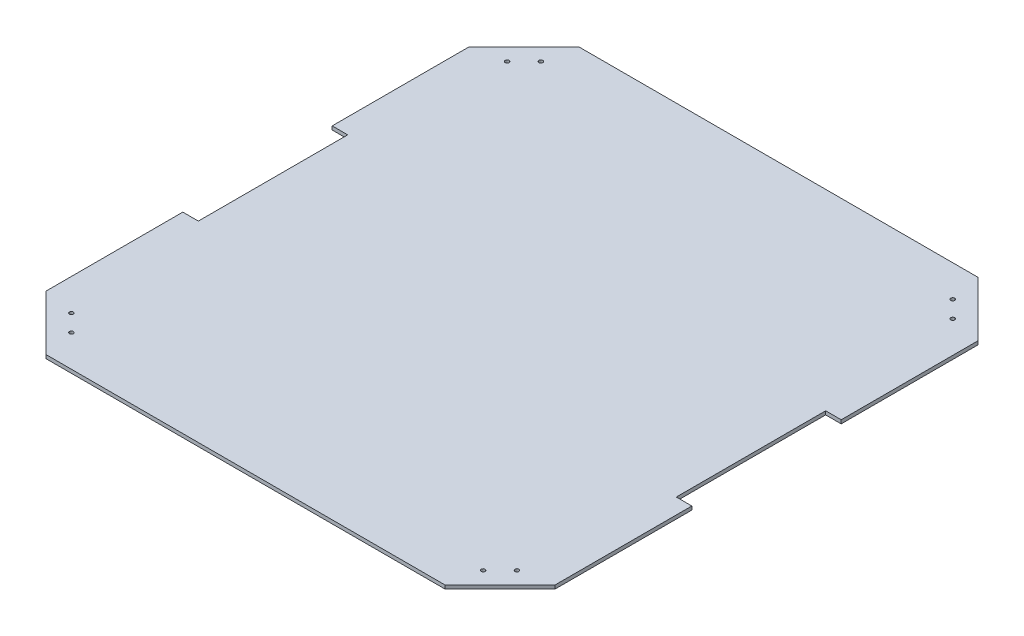
ISO-10303-21;
HEADER;
FILE_DESCRIPTION(('STEP AP214'),'2;1');
FILE_NAME('part.step','',(''),(''),'','','');
FILE_SCHEMA(('AUTOMOTIVE_DESIGN { 1 0 10303 214 1 1 1 1 }'));
ENDSEC;
DATA;
#1=APPLICATION_CONTEXT('core data for automotive mechanical design processes');
#2=APPLICATION_PROTOCOL_DEFINITION('international standard','automotive_design',2000,#1);
#3=PRODUCT_CONTEXT('',#1,'mechanical');
#4=PRODUCT('Part','Part','',(#3));
#5=PRODUCT_RELATED_PRODUCT_CATEGORY('part','',(#4));
#6=PRODUCT_DEFINITION_FORMATION('','',#4);
#7=PRODUCT_DEFINITION_CONTEXT('part definition',#1,'design');
#8=PRODUCT_DEFINITION('design','',#6,#7);
#9=PRODUCT_DEFINITION_SHAPE('','',#8);
#10=(LENGTH_UNIT() NAMED_UNIT(*) SI_UNIT(.MILLI.,.METRE.));
#11=(NAMED_UNIT(*) PLANE_ANGLE_UNIT() SI_UNIT($,.RADIAN.));
#12=(NAMED_UNIT(*) SI_UNIT($,.STERADIAN.) SOLID_ANGLE_UNIT());
#13=UNCERTAINTY_MEASURE_WITH_UNIT(LENGTH_MEASURE(1.E-05),#10,'distance_accuracy_value','');
#14=(GEOMETRIC_REPRESENTATION_CONTEXT(3) GLOBAL_UNCERTAINTY_ASSIGNED_CONTEXT((#13)) GLOBAL_UNIT_ASSIGNED_CONTEXT((#10,
#11,#12)) REPRESENTATION_CONTEXT('',''));
#15=CARTESIAN_POINT('',(0.,0.,0.));
#16=DIRECTION('',(0.,0.,1.));
#17=DIRECTION('',(1.,0.,0.));
#18=AXIS2_PLACEMENT_3D('',#15,#16,#17);
#19=CARTESIAN_POINT('',(-213.,3.,223.));
#20=DIRECTION('',(1.,0.,0.));
#21=DIRECTION('',(0.,0.,-1.));
#22=AXIS2_PLACEMENT_3D('',#19,#20,#21);
#23=PLANE('',#22);
#24=DIRECTION('',(0.,-1.,0.));
#25=VECTOR('',#24,1.);
#26=CARTESIAN_POINT('',(-213.,3.,62.5));
#27=LINE('',#26,#25);
#28=CARTESIAN_POINT('',(-213.,3.,62.5));
#29=VERTEX_POINT('',#28);
#30=CARTESIAN_POINT('',(-213.,0.,62.5));
#31=VERTEX_POINT('',#30);
#32=EDGE_CURVE('E132',#29,#31,#27,.T.);
#33=ORIENTED_EDGE('',*,*,#32,.T.);
#34=DIRECTION('',(0.,0.,1.));
#35=VECTOR('',#34,1.);
#36=CARTESIAN_POINT('',(-213.,0.,223.));
#37=LINE('',#36,#35);
#38=CARTESIAN_POINT('',(-213.,0.,177.));
#39=VERTEX_POINT('',#38);
#40=EDGE_CURVE('E142',#31,#39,#37,.T.);
#41=ORIENTED_EDGE('',*,*,#40,.T.);
#42=DIRECTION('',(0.,1.,0.));
#43=VECTOR('',#42,1.);
#44=CARTESIAN_POINT('',(-213.,3.,177.));
#45=LINE('',#44,#43);
#46=CARTESIAN_POINT('',(-213.,3.,177.));
#47=VERTEX_POINT('',#46);
#48=EDGE_CURVE('E155',#39,#47,#45,.T.);
#49=ORIENTED_EDGE('',*,*,#48,.T.);
#50=DIRECTION('',(0.,0.,1.));
#51=VECTOR('',#50,1.);
#52=CARTESIAN_POINT('',(-213.,3.,223.));
#53=LINE('',#52,#51);
#54=EDGE_CURVE('E148',#29,#47,#53,.T.);
#55=ORIENTED_EDGE('',*,*,#54,.F.);
#56=EDGE_LOOP('',(#33,#41,#49,#55));
#57=FACE_BOUND('',#56,.T.);
#58=ADVANCED_FACE('F17',(#57),#23,.F.);
#59=DIRECTION('',(0.,-1.,0.));
#60=VECTOR('',#59,1.);
#61=CARTESIAN_POINT('',(-213.,3.,-62.5));
#62=LINE('',#61,#60);
#63=CARTESIAN_POINT('',(-213.,3.,-62.5));
#64=VERTEX_POINT('',#63);
#65=CARTESIAN_POINT('',(-213.,0.,-62.5));
#66=VERTEX_POINT('',#65);
#67=EDGE_CURVE('E41',#64,#66,#62,.T.);
#68=ORIENTED_EDGE('',*,*,#67,.F.);
#69=CARTESIAN_POINT('',(-213.,3.,-177.));
#70=VERTEX_POINT('',#69);
#71=EDGE_CURVE('E157',#70,#64,#53,.T.);
#72=ORIENTED_EDGE('',*,*,#71,.F.);
#73=DIRECTION('',(0.,-1.,0.));
#74=VECTOR('',#73,1.);
#75=CARTESIAN_POINT('',(-213.,3.,-177.));
#76=LINE('',#75,#74);
#77=CARTESIAN_POINT('',(-213.,0.,-177.));
#78=VERTEX_POINT('',#77);
#79=EDGE_CURVE('E188',#70,#78,#76,.T.);
#80=ORIENTED_EDGE('',*,*,#79,.T.);
#81=EDGE_CURVE('E178',#78,#66,#37,.T.);
#82=ORIENTED_EDGE('',*,*,#81,.T.);
#83=EDGE_LOOP('',(#68,#72,#80,#82));
#84=FACE_BOUND('',#83,.T.);
#85=ADVANCED_FACE('F294',(#84),#23,.F.);
#86=CARTESIAN_POINT('',(213.,3.,223.));
#87=DIRECTION('',(-1.,0.,0.));
#88=DIRECTION('',(0.,0.,1.));
#89=AXIS2_PLACEMENT_3D('',#86,#87,#88);
#90=PLANE('',#89);
#91=DIRECTION('',(0.,-1.,0.));
#92=VECTOR('',#91,1.);
#93=CARTESIAN_POINT('',(213.,3.,-62.5));
#94=LINE('',#93,#92);
#95=CARTESIAN_POINT('',(213.,3.,-62.5));
#96=VERTEX_POINT('',#95);
#97=CARTESIAN_POINT('',(213.,0.,-62.5));
#98=VERTEX_POINT('',#97);
#99=EDGE_CURVE('E247',#96,#98,#94,.T.);
#100=ORIENTED_EDGE('',*,*,#99,.T.);
#101=DIRECTION('',(0.,0.,-1.));
#102=VECTOR('',#101,1.);
#103=CARTESIAN_POINT('',(213.,0.,223.));
#104=LINE('',#103,#102);
#105=CARTESIAN_POINT('',(213.,0.,-177.));
#106=VERTEX_POINT('',#105);
#107=EDGE_CURVE('E184',#98,#106,#104,.T.);
#108=ORIENTED_EDGE('',*,*,#107,.T.);
#109=DIRECTION('',(0.,1.,0.));
#110=VECTOR('',#109,1.);
#111=CARTESIAN_POINT('',(213.,3.,-177.));
#112=LINE('',#111,#110);
#113=CARTESIAN_POINT('',(213.,3.,-177.));
#114=VERTEX_POINT('',#113);
#115=EDGE_CURVE('E217',#106,#114,#112,.T.);
#116=ORIENTED_EDGE('',*,*,#115,.T.);
#117=DIRECTION('',(0.,0.,-1.));
#118=VECTOR('',#117,1.);
#119=CARTESIAN_POINT('',(213.,3.,223.));
#120=LINE('',#119,#118);
#121=EDGE_CURVE('E171',#96,#114,#120,.T.);
#122=ORIENTED_EDGE('',*,*,#121,.F.);
#123=EDGE_LOOP('',(#100,#108,#116,#122));
#124=FACE_BOUND('',#123,.T.);
#125=ADVANCED_FACE('F323',(#124),#90,.F.);
#126=DIRECTION('',(0.,-1.,0.));
#127=VECTOR('',#126,1.);
#128=CARTESIAN_POINT('',(213.,3.,62.5));
#129=LINE('',#128,#127);
#130=CARTESIAN_POINT('',(213.,3.,62.5));
#131=VERTEX_POINT('',#130);
#132=CARTESIAN_POINT('',(213.,0.,62.5));
#133=VERTEX_POINT('',#132);
#134=EDGE_CURVE('E33',#131,#133,#129,.T.);
#135=ORIENTED_EDGE('',*,*,#134,.F.);
#136=CARTESIAN_POINT('',(213.,3.,177.));
#137=VERTEX_POINT('',#136);
#138=EDGE_CURVE('E172',#137,#131,#120,.T.);
#139=ORIENTED_EDGE('',*,*,#138,.F.);
#140=DIRECTION('',(0.,-1.,0.));
#141=VECTOR('',#140,1.);
#142=CARTESIAN_POINT('',(213.,3.,177.));
#143=LINE('',#142,#141);
#144=CARTESIAN_POINT('',(213.,0.,177.));
#145=VERTEX_POINT('',#144);
#146=EDGE_CURVE('E214',#137,#145,#143,.T.);
#147=ORIENTED_EDGE('',*,*,#146,.T.);
#148=EDGE_CURVE('E163',#145,#133,#104,.T.);
#149=ORIENTED_EDGE('',*,*,#148,.T.);
#150=EDGE_LOOP('',(#135,#139,#147,#149));
#151=FACE_BOUND('',#150,.T.);
#152=ADVANCED_FACE('F231',(#151),#90,.F.);
#153=CARTESIAN_POINT('',(0.,3.,0.));
#154=DIRECTION('',(0.,1.,0.));
#155=DIRECTION('',(0.,0.,1.));
#156=AXIS2_PLACEMENT_3D('',#153,#154,#155);
#157=PLANE('',#156);
#158=CARTESIAN_POINT('',(186.464466094067,3.,182.322330470337));
#159=DIRECTION('',(0.,1.,0.));
#160=DIRECTION('',(0.,0.,-1.));
#161=AXIS2_PLACEMENT_3D('',#158,#159,#160);
#162=CIRCLE('',#161,1.65);
#163=CARTESIAN_POINT('',(186.464466094067,3.,180.672330470336));
#164=VERTEX_POINT('',#163);
#165=EDGE_CURVE('E565',#164,#164,#162,.T.);
#166=ORIENTED_EDGE('',*,*,#165,.F.);
#167=EDGE_LOOP('',(#166));
#168=FACE_BOUND('',#167,.T.);
#169=CARTESIAN_POINT('',(172.322330470336,3.,196.464466094067));
#170=DIRECTION('',(0.,1.,0.));
#171=DIRECTION('',(0.,0.,-1.));
#172=AXIS2_PLACEMENT_3D('',#169,#170,#171);
#173=CIRCLE('',#172,1.65);
#174=CARTESIAN_POINT('',(172.322330470336,3.,194.814466094067));
#175=VERTEX_POINT('',#174);
#176=EDGE_CURVE('E569',#175,#175,#173,.T.);
#177=ORIENTED_EDGE('',*,*,#176,.F.);
#178=EDGE_LOOP('',(#177));
#179=FACE_BOUND('',#178,.T.);
#180=CARTESIAN_POINT('',(186.464466094067,3.,-182.322330470337));
#181=DIRECTION('',(0.,-1.,0.));
#182=DIRECTION('',(0.,0.,1.));
#183=AXIS2_PLACEMENT_3D('',#180,#181,#182);
#184=CIRCLE('',#183,1.65);
#185=CARTESIAN_POINT('',(186.464466094067,3.,-180.672330470336));
#186=VERTEX_POINT('',#185);
#187=EDGE_CURVE('E579',#186,#186,#184,.T.);
#188=ORIENTED_EDGE('',*,*,#187,.T.);
#189=EDGE_LOOP('',(#188));
#190=FACE_BOUND('',#189,.T.);
#191=CARTESIAN_POINT('',(172.322330470336,3.,-196.464466094067));
#192=DIRECTION('',(0.,-1.,0.));
#193=DIRECTION('',(0.,0.,1.));
#194=AXIS2_PLACEMENT_3D('',#191,#192,#193);
#195=CIRCLE('',#194,1.65);
#196=CARTESIAN_POINT('',(172.322330470336,3.,-194.814466094067));
#197=VERTEX_POINT('',#196);
#198=EDGE_CURVE('E585',#197,#197,#195,.T.);
#199=ORIENTED_EDGE('',*,*,#198,.T.);
#200=EDGE_LOOP('',(#199));
#201=FACE_BOUND('',#200,.T.);
#202=CARTESIAN_POINT('',(-186.464466094067,3.,182.322330470337));
#203=DIRECTION('',(0.,-1.,0.));
#204=DIRECTION('',(0.,0.,-1.));
#205=AXIS2_PLACEMENT_3D('',#202,#203,#204);
#206=CIRCLE('',#205,1.65);
#207=CARTESIAN_POINT('',(-186.464466094067,3.,180.672330470336));
#208=VERTEX_POINT('',#207);
#209=EDGE_CURVE('E288',#208,#208,#206,.T.);
#210=ORIENTED_EDGE('',*,*,#209,.T.);
#211=EDGE_LOOP('',(#210));
#212=FACE_BOUND('',#211,.T.);
#213=CARTESIAN_POINT('',(-172.322330470336,3.,196.464466094067));
#214=DIRECTION('',(0.,-1.,0.));
#215=DIRECTION('',(0.,0.,-1.));
#216=AXIS2_PLACEMENT_3D('',#213,#214,#215);
#217=CIRCLE('',#216,1.65);
#218=CARTESIAN_POINT('',(-172.322330470336,3.,194.814466094067));
#219=VERTEX_POINT('',#218);
#220=EDGE_CURVE('E594',#219,#219,#217,.T.);
#221=ORIENTED_EDGE('',*,*,#220,.T.);
#222=EDGE_LOOP('',(#221));
#223=FACE_BOUND('',#222,.T.);
#224=CARTESIAN_POINT('',(-186.464466094067,3.,-182.322330470337));
#225=DIRECTION('',(0.,1.,0.));
#226=DIRECTION('',(0.,0.,1.));
#227=AXIS2_PLACEMENT_3D('',#224,#225,#226);
#228=CIRCLE('',#227,1.65);
#229=CARTESIAN_POINT('',(-186.464466094067,3.,-180.672330470336));
#230=VERTEX_POINT('',#229);
#231=EDGE_CURVE('E270',#230,#230,#228,.T.);
#232=ORIENTED_EDGE('',*,*,#231,.F.);
#233=EDGE_LOOP('',(#232));
#234=FACE_BOUND('',#233,.T.);
#235=CARTESIAN_POINT('',(-172.322330470336,3.,-196.464466094067));
#236=DIRECTION('',(0.,1.,0.));
#237=DIRECTION('',(0.,0.,1.));
#238=AXIS2_PLACEMENT_3D('',#235,#236,#237);
#239=CIRCLE('',#238,1.65);
#240=CARTESIAN_POINT('',(-172.322330470336,3.,-194.814466094067));
#241=VERTEX_POINT('',#240);
#242=EDGE_CURVE('E278',#241,#241,#239,.T.);
#243=ORIENTED_EDGE('',*,*,#242,.F.);
#244=EDGE_LOOP('',(#243));
#245=FACE_BOUND('',#244,.T.);
#246=DIRECTION('',(0.,0.,-1.));
#247=VECTOR('',#246,1.);
#248=CARTESIAN_POINT('',(-200.,3.,-62.5));
#249=LINE('',#248,#247);
#250=CARTESIAN_POINT('',(-200.,3.,62.5));
#251=VERTEX_POINT('',#250);
#252=CARTESIAN_POINT('',(-200.,3.,-62.5));
#253=VERTEX_POINT('',#252);
#254=EDGE_CURVE('E151',#251,#253,#249,.T.);
#255=ORIENTED_EDGE('',*,*,#254,.F.);
#256=DIRECTION('',(1.,0.,0.));
#257=VECTOR('',#256,1.);
#258=CARTESIAN_POINT('',(-213.,3.,62.5));
#259=LINE('',#258,#257);
#260=EDGE_CURVE('E135',#29,#251,#259,.T.);
#261=ORIENTED_EDGE('',*,*,#260,.F.);
#262=ORIENTED_EDGE('',*,*,#54,.T.);
#263=DIRECTION('',(-0.707106781186546,0.,-0.707106781186549));
#264=VECTOR('',#263,1.);
#265=CARTESIAN_POINT('',(-195.,3.,195.));
#266=LINE('',#265,#264);
#267=CARTESIAN_POINT('',(-167.,3.,223.));
#268=VERTEX_POINT('',#267);
#269=EDGE_CURVE('E208',#47,#268,#266,.F.);
#270=ORIENTED_EDGE('',*,*,#269,.T.);
#271=DIRECTION('',(1.,0.,0.));
#272=VECTOR('',#271,1.);
#273=CARTESIAN_POINT('',(213.,3.,223.));
#274=LINE('',#273,#272);
#275=CARTESIAN_POINT('',(167.,3.,223.));
#276=VERTEX_POINT('',#275);
#277=EDGE_CURVE('E161',#268,#276,#274,.T.);
#278=ORIENTED_EDGE('',*,*,#277,.T.);
#279=DIRECTION('',(-0.707106781186549,0.,0.707106781186546));
#280=VECTOR('',#279,1.);
#281=CARTESIAN_POINT('',(195.,3.,195.));
#282=LINE('',#281,#280);
#283=EDGE_CURVE('E206',#276,#137,#282,.F.);
#284=ORIENTED_EDGE('',*,*,#283,.T.);
#285=ORIENTED_EDGE('',*,*,#138,.T.);
#286=DIRECTION('',(1.,0.,0.));
#287=VECTOR('',#286,1.);
#288=CARTESIAN_POINT('',(213.,3.,62.5));
#289=LINE('',#288,#287);
#290=CARTESIAN_POINT('',(200.,3.,62.5));
#291=VERTEX_POINT('',#290);
#292=EDGE_CURVE('E250',#291,#131,#289,.T.);
#293=ORIENTED_EDGE('',*,*,#292,.F.);
#294=DIRECTION('',(0.,0.,1.));
#295=VECTOR('',#294,1.);
#296=CARTESIAN_POINT('',(200.,3.,-62.5));
#297=LINE('',#296,#295);
#298=CARTESIAN_POINT('',(200.,3.,-62.5));
#299=VERTEX_POINT('',#298);
#300=EDGE_CURVE('E241',#299,#291,#297,.T.);
#301=ORIENTED_EDGE('',*,*,#300,.F.);
#302=DIRECTION('',(-1.,0.,0.));
#303=VECTOR('',#302,1.);
#304=CARTESIAN_POINT('',(213.,3.,-62.5));
#305=LINE('',#304,#303);
#306=EDGE_CURVE('E239',#96,#299,#305,.T.);
#307=ORIENTED_EDGE('',*,*,#306,.F.);
#308=ORIENTED_EDGE('',*,*,#121,.T.);
#309=DIRECTION('',(0.707106781186546,0.,0.707106781186549));
#310=VECTOR('',#309,1.);
#311=CARTESIAN_POINT('',(195.,3.,-195.));
#312=LINE('',#311,#310);
#313=CARTESIAN_POINT('',(167.,3.,-223.));
#314=VERTEX_POINT('',#313);
#315=EDGE_CURVE('E210',#114,#314,#312,.F.);
#316=ORIENTED_EDGE('',*,*,#315,.T.);
#317=DIRECTION('',(-1.,0.,0.));
#318=VECTOR('',#317,1.);
#319=CARTESIAN_POINT('',(213.,3.,-223.));
#320=LINE('',#319,#318);
#321=CARTESIAN_POINT('',(-167.,3.,-223.));
#322=VERTEX_POINT('',#321);
#323=EDGE_CURVE('E175',#314,#322,#320,.T.);
#324=ORIENTED_EDGE('',*,*,#323,.T.);
#325=DIRECTION('',(0.707106781186549,0.,-0.707106781186546));
#326=VECTOR('',#325,1.);
#327=CARTESIAN_POINT('',(-195.,3.,-195.));
#328=LINE('',#327,#326);
#329=EDGE_CURVE('E212',#322,#70,#328,.F.);
#330=ORIENTED_EDGE('',*,*,#329,.T.);
#331=ORIENTED_EDGE('',*,*,#71,.T.);
#332=DIRECTION('',(-1.,0.,0.));
#333=VECTOR('',#332,1.);
#334=CARTESIAN_POINT('',(-213.,3.,-62.5));
#335=LINE('',#334,#333);
#336=EDGE_CURVE('E261',#253,#64,#335,.T.);
#337=ORIENTED_EDGE('',*,*,#336,.F.);
#338=EDGE_LOOP('',(#255,#261,#262,#270,#278,#284,#285,#293,#301,#307,#308,#316,#324,#330,#331,#337));
#339=FACE_BOUND('',#338,.T.);
#340=ADVANCED_FACE('F147',(#168,#179,#190,#201,#212,#223,#234,#245,#339),#157,.T.);
#341=CARTESIAN_POINT('',(0.,0.,0.));
#342=DIRECTION('',(0.,1.,0.));
#343=DIRECTION('',(0.,0.,1.));
#344=AXIS2_PLACEMENT_3D('',#341,#342,#343);
#345=PLANE('',#344);
#346=CARTESIAN_POINT('',(186.464466094067,0.,182.322330470337));
#347=DIRECTION('',(0.,1.,0.));
#348=DIRECTION('',(0.,0.,-1.));
#349=AXIS2_PLACEMENT_3D('',#346,#347,#348);
#350=CIRCLE('',#349,1.65);
#351=CARTESIAN_POINT('',(186.464466094067,0.,180.672330470336));
#352=VERTEX_POINT('',#351);
#353=EDGE_CURVE('E568',#352,#352,#350,.T.);
#354=ORIENTED_EDGE('',*,*,#353,.T.);
#355=EDGE_LOOP('',(#354));
#356=FACE_BOUND('',#355,.T.);
#357=CARTESIAN_POINT('',(172.322330470336,0.,196.464466094067));
#358=DIRECTION('',(0.,1.,0.));
#359=DIRECTION('',(0.,0.,-1.));
#360=AXIS2_PLACEMENT_3D('',#357,#358,#359);
#361=CIRCLE('',#360,1.65);
#362=CARTESIAN_POINT('',(172.322330470336,0.,194.814466094067));
#363=VERTEX_POINT('',#362);
#364=EDGE_CURVE('E574',#363,#363,#361,.T.);
#365=ORIENTED_EDGE('',*,*,#364,.T.);
#366=EDGE_LOOP('',(#365));
#367=FACE_BOUND('',#366,.T.);
#368=CARTESIAN_POINT('',(186.464466094067,0.,-182.322330470337));
#369=DIRECTION('',(0.,-1.,0.));
#370=DIRECTION('',(0.,0.,1.));
#371=AXIS2_PLACEMENT_3D('',#368,#369,#370);
#372=CIRCLE('',#371,1.65);
#373=CARTESIAN_POINT('',(186.464466094067,0.,-180.672330470336));
#374=VERTEX_POINT('',#373);
#375=EDGE_CURVE('E582',#374,#374,#372,.T.);
#376=ORIENTED_EDGE('',*,*,#375,.F.);
#377=EDGE_LOOP('',(#376));
#378=FACE_BOUND('',#377,.T.);
#379=CARTESIAN_POINT('',(172.322330470336,0.,-196.464466094067));
#380=DIRECTION('',(0.,-1.,0.));
#381=DIRECTION('',(0.,0.,1.));
#382=AXIS2_PLACEMENT_3D('',#379,#380,#381);
#383=CIRCLE('',#382,1.65);
#384=CARTESIAN_POINT('',(172.322330470336,0.,-194.814466094067));
#385=VERTEX_POINT('',#384);
#386=EDGE_CURVE('E571',#385,#385,#383,.T.);
#387=ORIENTED_EDGE('',*,*,#386,.F.);
#388=EDGE_LOOP('',(#387));
#389=FACE_BOUND('',#388,.T.);
#390=CARTESIAN_POINT('',(-186.464466094067,0.,182.322330470337));
#391=DIRECTION('',(0.,-1.,0.));
#392=DIRECTION('',(0.,0.,-1.));
#393=AXIS2_PLACEMENT_3D('',#390,#391,#392);
#394=CIRCLE('',#393,1.65);
#395=CARTESIAN_POINT('',(-186.464466094067,0.,180.672330470336));
#396=VERTEX_POINT('',#395);
#397=EDGE_CURVE('E592',#396,#396,#394,.T.);
#398=ORIENTED_EDGE('',*,*,#397,.F.);
#399=EDGE_LOOP('',(#398));
#400=FACE_BOUND('',#399,.T.);
#401=CARTESIAN_POINT('',(-172.322330470336,0.,196.464466094067));
#402=DIRECTION('',(0.,-1.,0.));
#403=DIRECTION('',(0.,0.,-1.));
#404=AXIS2_PLACEMENT_3D('',#401,#402,#403);
#405=CIRCLE('',#404,1.65);
#406=CARTESIAN_POINT('',(-172.322330470336,0.,194.814466094067));
#407=VERTEX_POINT('',#406);
#408=EDGE_CURVE('E281',#407,#407,#405,.T.);
#409=ORIENTED_EDGE('',*,*,#408,.F.);
#410=EDGE_LOOP('',(#409));
#411=FACE_BOUND('',#410,.T.);
#412=CARTESIAN_POINT('',(-186.464466094067,0.,-182.322330470337));
#413=DIRECTION('',(0.,1.,0.));
#414=DIRECTION('',(0.,0.,1.));
#415=AXIS2_PLACEMENT_3D('',#412,#413,#414);
#416=CIRCLE('',#415,1.65);
#417=CARTESIAN_POINT('',(-186.464466094067,0.,-180.672330470336));
#418=VERTEX_POINT('',#417);
#419=EDGE_CURVE('E273',#418,#418,#416,.T.);
#420=ORIENTED_EDGE('',*,*,#419,.T.);
#421=EDGE_LOOP('',(#420));
#422=FACE_BOUND('',#421,.T.);
#423=CARTESIAN_POINT('',(-172.322330470336,0.,-196.464466094067));
#424=DIRECTION('',(0.,1.,0.));
#425=DIRECTION('',(0.,0.,1.));
#426=AXIS2_PLACEMENT_3D('',#423,#424,#425);
#427=CIRCLE('',#426,1.65);
#428=CARTESIAN_POINT('',(-172.322330470336,0.,-194.814466094067));
#429=VERTEX_POINT('',#428);
#430=EDGE_CURVE('E286',#429,#429,#427,.T.);
#431=ORIENTED_EDGE('',*,*,#430,.T.);
#432=EDGE_LOOP('',(#431));
#433=FACE_BOUND('',#432,.T.);
#434=DIRECTION('',(1.,0.,0.));
#435=VECTOR('',#434,1.);
#436=CARTESIAN_POINT('',(-213.,0.,62.5));
#437=LINE('',#436,#435);
#438=CARTESIAN_POINT('',(-200.,0.,62.5));
#439=VERTEX_POINT('',#438);
#440=EDGE_CURVE('E138',#31,#439,#437,.T.);
#441=ORIENTED_EDGE('',*,*,#440,.T.);
#442=DIRECTION('',(0.,0.,-1.));
#443=VECTOR('',#442,1.);
#444=CARTESIAN_POINT('',(-200.,0.,-62.5));
#445=LINE('',#444,#443);
#446=CARTESIAN_POINT('',(-200.,0.,-62.5));
#447=VERTEX_POINT('',#446);
#448=EDGE_CURVE('E256',#439,#447,#445,.T.);
#449=ORIENTED_EDGE('',*,*,#448,.T.);
#450=DIRECTION('',(-1.,0.,0.));
#451=VECTOR('',#450,1.);
#452=CARTESIAN_POINT('',(-213.,0.,-62.5));
#453=LINE('',#452,#451);
#454=EDGE_CURVE('E152',#447,#66,#453,.T.);
#455=ORIENTED_EDGE('',*,*,#454,.T.);
#456=ORIENTED_EDGE('',*,*,#81,.F.);
#457=DIRECTION('',(-0.707106781186549,0.,0.707106781186546));
#458=VECTOR('',#457,1.);
#459=CARTESIAN_POINT('',(-213.,0.,-177.));
#460=LINE('',#459,#458);
#461=CARTESIAN_POINT('',(-167.,0.,-223.));
#462=VERTEX_POINT('',#461);
#463=EDGE_CURVE('E199',#78,#462,#460,.F.);
#464=ORIENTED_EDGE('',*,*,#463,.T.);
#465=DIRECTION('',(-1.,0.,0.));
#466=VECTOR('',#465,1.);
#467=CARTESIAN_POINT('',(213.,0.,-223.));
#468=LINE('',#467,#466);
#469=CARTESIAN_POINT('',(167.,0.,-223.));
#470=VERTEX_POINT('',#469);
#471=EDGE_CURVE('E158',#470,#462,#468,.T.);
#472=ORIENTED_EDGE('',*,*,#471,.F.);
#473=DIRECTION('',(-0.707106781186546,0.,-0.707106781186549));
#474=VECTOR('',#473,1.);
#475=CARTESIAN_POINT('',(167.,0.,-223.));
#476=LINE('',#475,#474);
#477=EDGE_CURVE('E196',#470,#106,#476,.F.);
#478=ORIENTED_EDGE('',*,*,#477,.T.);
#479=ORIENTED_EDGE('',*,*,#107,.F.);
#480=DIRECTION('',(-1.,0.,0.));
#481=VECTOR('',#480,1.);
#482=CARTESIAN_POINT('',(213.,0.,-62.5));
#483=LINE('',#482,#481);
#484=CARTESIAN_POINT('',(200.,0.,-62.5));
#485=VERTEX_POINT('',#484);
#486=EDGE_CURVE('E243',#98,#485,#483,.T.);
#487=ORIENTED_EDGE('',*,*,#486,.T.);
#488=DIRECTION('',(0.,0.,1.));
#489=VECTOR('',#488,1.);
#490=CARTESIAN_POINT('',(200.,0.,-62.5));
#491=LINE('',#490,#489);
#492=CARTESIAN_POINT('',(200.,0.,62.5));
#493=VERTEX_POINT('',#492);
#494=EDGE_CURVE('E237',#485,#493,#491,.T.);
#495=ORIENTED_EDGE('',*,*,#494,.T.);
#496=DIRECTION('',(1.,0.,0.));
#497=VECTOR('',#496,1.);
#498=CARTESIAN_POINT('',(213.,0.,62.5));
#499=LINE('',#498,#497);
#500=EDGE_CURVE('E235',#493,#133,#499,.T.);
#501=ORIENTED_EDGE('',*,*,#500,.T.);
#502=ORIENTED_EDGE('',*,*,#148,.F.);
#503=DIRECTION('',(0.707106781186549,0.,-0.707106781186546));
#504=VECTOR('',#503,1.);
#505=CARTESIAN_POINT('',(213.,0.,177.));
#506=LINE('',#505,#504);
#507=CARTESIAN_POINT('',(167.,0.,223.));
#508=VERTEX_POINT('',#507);
#509=EDGE_CURVE('E191',#145,#508,#506,.F.);
#510=ORIENTED_EDGE('',*,*,#509,.T.);
#511=DIRECTION('',(1.,0.,0.));
#512=VECTOR('',#511,1.);
#513=CARTESIAN_POINT('',(213.,0.,223.));
#514=LINE('',#513,#512);
#515=CARTESIAN_POINT('',(-167.,0.,223.));
#516=VERTEX_POINT('',#515);
#517=EDGE_CURVE('E181',#516,#508,#514,.T.);
#518=ORIENTED_EDGE('',*,*,#517,.F.);
#519=DIRECTION('',(0.707106781186546,0.,0.707106781186549));
#520=VECTOR('',#519,1.);
#521=CARTESIAN_POINT('',(-167.,0.,223.));
#522=LINE('',#521,#520);
#523=EDGE_CURVE('E193',#516,#39,#522,.F.);
#524=ORIENTED_EDGE('',*,*,#523,.T.);
#525=ORIENTED_EDGE('',*,*,#40,.F.);
#526=EDGE_LOOP('',(#441,#449,#455,#456,#464,#472,#478,#479,#487,#495,#501,#502,#510,#518,#524,#525));
#527=FACE_BOUND('',#526,.T.);
#528=ADVANCED_FACE('F233',(#356,#367,#378,#389,#400,#411,#422,#433,#527),#345,.F.);
#529=CARTESIAN_POINT('',(213.,3.,223.));
#530=DIRECTION('',(0.,0.,-1.));
#531=DIRECTION('',(-1.,0.,0.));
#532=AXIS2_PLACEMENT_3D('',#529,#530,#531);
#533=PLANE('',#532);
#534=ORIENTED_EDGE('',*,*,#277,.F.);
#535=DIRECTION('',(0.,-1.,0.));
#536=VECTOR('',#535,1.);
#537=CARTESIAN_POINT('',(-167.,3.,223.));
#538=LINE('',#537,#536);
#539=EDGE_CURVE('E11',#268,#516,#538,.T.);
#540=ORIENTED_EDGE('',*,*,#539,.T.);
#541=ORIENTED_EDGE('',*,*,#517,.T.);
#542=DIRECTION('',(0.,1.,0.));
#543=VECTOR('',#542,1.);
#544=CARTESIAN_POINT('',(167.,3.,223.));
#545=LINE('',#544,#543);
#546=EDGE_CURVE('E26',#508,#276,#545,.T.);
#547=ORIENTED_EDGE('',*,*,#546,.T.);
#548=EDGE_LOOP('',(#534,#540,#541,#547));
#549=FACE_BOUND('',#548,.T.);
#550=ADVANCED_FACE('F222',(#549),#533,.F.);
#551=CARTESIAN_POINT('',(213.,3.,-223.));
#552=DIRECTION('',(0.,0.,1.));
#553=DIRECTION('',(1.,0.,0.));
#554=AXIS2_PLACEMENT_3D('',#551,#552,#553);
#555=PLANE('',#554);
#556=ORIENTED_EDGE('',*,*,#471,.T.);
#557=DIRECTION('',(0.,1.,0.));
#558=VECTOR('',#557,1.);
#559=CARTESIAN_POINT('',(-167.,3.,-223.));
#560=LINE('',#559,#558);
#561=EDGE_CURVE('E204',#462,#322,#560,.T.);
#562=ORIENTED_EDGE('',*,*,#561,.T.);
#563=ORIENTED_EDGE('',*,*,#323,.F.);
#564=DIRECTION('',(0.,-1.,0.));
#565=VECTOR('',#564,1.);
#566=CARTESIAN_POINT('',(167.,3.,-223.));
#567=LINE('',#566,#565);
#568=EDGE_CURVE('E201',#314,#470,#567,.T.);
#569=ORIENTED_EDGE('',*,*,#568,.T.);
#570=EDGE_LOOP('',(#556,#562,#563,#569));
#571=FACE_BOUND('',#570,.T.);
#572=ADVANCED_FACE('F335',(#571),#555,.F.);
#573=CARTESIAN_POINT('',(-213.,3.,-177.));
#574=DIRECTION('',(0.707106781186546,0.,0.707106781186549));
#575=DIRECTION('',(0.,-1.,0.));
#576=AXIS2_PLACEMENT_3D('',#573,#574,#575);
#577=PLANE('',#576);
#578=ORIENTED_EDGE('',*,*,#329,.F.);
#579=ORIENTED_EDGE('',*,*,#561,.F.);
#580=ORIENTED_EDGE('',*,*,#463,.F.);
#581=ORIENTED_EDGE('',*,*,#79,.F.);
#582=EDGE_LOOP('',(#578,#579,#580,#581));
#583=FACE_BOUND('',#582,.T.);
#584=ADVANCED_FACE('F301',(#583),#577,.F.);
#585=CARTESIAN_POINT('',(167.,3.,-223.));
#586=DIRECTION('',(-0.707106781186549,0.,0.707106781186546));
#587=DIRECTION('',(0.,-1.,0.));
#588=AXIS2_PLACEMENT_3D('',#585,#586,#587);
#589=PLANE('',#588);
#590=ORIENTED_EDGE('',*,*,#315,.F.);
#591=ORIENTED_EDGE('',*,*,#115,.F.);
#592=ORIENTED_EDGE('',*,*,#477,.F.);
#593=ORIENTED_EDGE('',*,*,#568,.F.);
#594=EDGE_LOOP('',(#590,#591,#592,#593));
#595=FACE_BOUND('',#594,.T.);
#596=ADVANCED_FACE('F334',(#595),#589,.F.);
#597=CARTESIAN_POINT('',(-167.,3.,223.));
#598=DIRECTION('',(0.707106781186549,0.,-0.707106781186546));
#599=DIRECTION('',(0.,-1.,0.));
#600=AXIS2_PLACEMENT_3D('',#597,#598,#599);
#601=PLANE('',#600);
#602=ORIENTED_EDGE('',*,*,#269,.F.);
#603=ORIENTED_EDGE('',*,*,#48,.F.);
#604=ORIENTED_EDGE('',*,*,#523,.F.);
#605=ORIENTED_EDGE('',*,*,#539,.F.);
#606=EDGE_LOOP('',(#602,#603,#604,#605));
#607=FACE_BOUND('',#606,.T.);
#608=ADVANCED_FACE('F340',(#607),#601,.F.);
#609=CARTESIAN_POINT('',(213.,3.,177.));
#610=DIRECTION('',(-0.707106781186546,0.,-0.707106781186549));
#611=DIRECTION('',(0.,-1.,0.));
#612=AXIS2_PLACEMENT_3D('',#609,#610,#611);
#613=PLANE('',#612);
#614=ORIENTED_EDGE('',*,*,#283,.F.);
#615=ORIENTED_EDGE('',*,*,#546,.F.);
#616=ORIENTED_EDGE('',*,*,#509,.F.);
#617=ORIENTED_EDGE('',*,*,#146,.F.);
#618=EDGE_LOOP('',(#614,#615,#616,#617));
#619=FACE_BOUND('',#618,.T.);
#620=ADVANCED_FACE('F20',(#619),#613,.F.);
#621=CARTESIAN_POINT('',(213.,3.,-62.5));
#622=DIRECTION('',(0.,0.,1.));
#623=DIRECTION('',(1.,0.,0.));
#624=AXIS2_PLACEMENT_3D('',#621,#622,#623);
#625=PLANE('',#624);
#626=ORIENTED_EDGE('',*,*,#486,.F.);
#627=ORIENTED_EDGE('',*,*,#99,.F.);
#628=ORIENTED_EDGE('',*,*,#306,.T.);
#629=DIRECTION('',(0.,-1.,0.));
#630=VECTOR('',#629,1.);
#631=CARTESIAN_POINT('',(200.,3.,-62.5));
#632=LINE('',#631,#630);
#633=EDGE_CURVE('E167',#299,#485,#632,.T.);
#634=ORIENTED_EDGE('',*,*,#633,.T.);
#635=EDGE_LOOP('',(#626,#627,#628,#634));
#636=FACE_BOUND('',#635,.T.);
#637=ADVANCED_FACE('F350',(#636),#625,.T.);
#638=CARTESIAN_POINT('',(200.,3.,-62.5));
#639=DIRECTION('',(1.,0.,0.));
#640=DIRECTION('',(0.,0.,-1.));
#641=AXIS2_PLACEMENT_3D('',#638,#639,#640);
#642=PLANE('',#641);
#643=ORIENTED_EDGE('',*,*,#494,.F.);
#644=ORIENTED_EDGE('',*,*,#633,.F.);
#645=ORIENTED_EDGE('',*,*,#300,.T.);
#646=DIRECTION('',(0.,-1.,0.));
#647=VECTOR('',#646,1.);
#648=CARTESIAN_POINT('',(200.,3.,62.5));
#649=LINE('',#648,#647);
#650=EDGE_CURVE('E251',#291,#493,#649,.T.);
#651=ORIENTED_EDGE('',*,*,#650,.T.);
#652=EDGE_LOOP('',(#643,#644,#645,#651));
#653=FACE_BOUND('',#652,.T.);
#654=ADVANCED_FACE('F355',(#653),#642,.T.);
#655=CARTESIAN_POINT('',(213.,3.,62.5));
#656=DIRECTION('',(0.,0.,-1.));
#657=DIRECTION('',(-1.,0.,0.));
#658=AXIS2_PLACEMENT_3D('',#655,#656,#657);
#659=PLANE('',#658);
#660=ORIENTED_EDGE('',*,*,#500,.F.);
#661=ORIENTED_EDGE('',*,*,#650,.F.);
#662=ORIENTED_EDGE('',*,*,#292,.T.);
#663=ORIENTED_EDGE('',*,*,#134,.T.);
#664=EDGE_LOOP('',(#660,#661,#662,#663));
#665=FACE_BOUND('',#664,.T.);
#666=ADVANCED_FACE('F315',(#665),#659,.T.);
#667=CARTESIAN_POINT('',(-213.,3.,62.5));
#668=DIRECTION('',(0.,0.,-1.));
#669=DIRECTION('',(-1.,0.,0.));
#670=AXIS2_PLACEMENT_3D('',#667,#668,#669);
#671=PLANE('',#670);
#672=ORIENTED_EDGE('',*,*,#440,.F.);
#673=ORIENTED_EDGE('',*,*,#32,.F.);
#674=ORIENTED_EDGE('',*,*,#260,.T.);
#675=DIRECTION('',(0.,-1.,0.));
#676=VECTOR('',#675,1.);
#677=CARTESIAN_POINT('',(-200.,3.,62.5));
#678=LINE('',#677,#676);
#679=EDGE_CURVE('E143',#251,#439,#678,.T.);
#680=ORIENTED_EDGE('',*,*,#679,.T.);
#681=EDGE_LOOP('',(#672,#673,#674,#680));
#682=FACE_BOUND('',#681,.T.);
#683=ADVANCED_FACE('F134',(#682),#671,.T.);
#684=CARTESIAN_POINT('',(-200.,3.,-62.5));
#685=DIRECTION('',(-1.,0.,0.));
#686=DIRECTION('',(0.,0.,1.));
#687=AXIS2_PLACEMENT_3D('',#684,#685,#686);
#688=PLANE('',#687);
#689=ORIENTED_EDGE('',*,*,#448,.F.);
#690=ORIENTED_EDGE('',*,*,#679,.F.);
#691=ORIENTED_EDGE('',*,*,#254,.T.);
#692=DIRECTION('',(0.,-1.,0.));
#693=VECTOR('',#692,1.);
#694=CARTESIAN_POINT('',(-200.,3.,-62.5));
#695=LINE('',#694,#693);
#696=EDGE_CURVE('E266',#253,#447,#695,.T.);
#697=ORIENTED_EDGE('',*,*,#696,.T.);
#698=EDGE_LOOP('',(#689,#690,#691,#697));
#699=FACE_BOUND('',#698,.T.);
#700=ADVANCED_FACE('F304',(#699),#688,.T.);
#701=CARTESIAN_POINT('',(-213.,3.,-62.5));
#702=DIRECTION('',(0.,0.,1.));
#703=DIRECTION('',(1.,0.,0.));
#704=AXIS2_PLACEMENT_3D('',#701,#702,#703);
#705=PLANE('',#704);
#706=ORIENTED_EDGE('',*,*,#454,.F.);
#707=ORIENTED_EDGE('',*,*,#696,.F.);
#708=ORIENTED_EDGE('',*,*,#336,.T.);
#709=ORIENTED_EDGE('',*,*,#67,.T.);
#710=EDGE_LOOP('',(#706,#707,#708,#709));
#711=FACE_BOUND('',#710,.T.);
#712=ADVANCED_FACE('F291',(#711),#705,.T.);
#713=CARTESIAN_POINT('',(-172.322330470336,3.,-196.464466094067));
#714=DIRECTION('',(0.,-1.,0.));
#715=DIRECTION('',(0.,0.,-1.));
#716=AXIS2_PLACEMENT_3D('',#713,#714,#715);
#717=CYLINDRICAL_SURFACE('',#716,1.65);
#718=ORIENTED_EDGE('',*,*,#242,.T.);
#719=EDGE_LOOP('',(#718));
#720=FACE_BOUND('',#719,.T.);
#721=ORIENTED_EDGE('',*,*,#430,.F.);
#722=EDGE_LOOP('',(#721));
#723=FACE_BOUND('',#722,.T.);
#724=ADVANCED_FACE('F313',(#720,#723),#717,.F.);
#725=CARTESIAN_POINT('',(-186.464466094067,3.,-182.322330470337));
#726=DIRECTION('',(0.,-1.,0.));
#727=DIRECTION('',(0.,0.,-1.));
#728=AXIS2_PLACEMENT_3D('',#725,#726,#727);
#729=CYLINDRICAL_SURFACE('',#728,1.65);
#730=ORIENTED_EDGE('',*,*,#231,.T.);
#731=EDGE_LOOP('',(#730));
#732=FACE_BOUND('',#731,.T.);
#733=ORIENTED_EDGE('',*,*,#419,.F.);
#734=EDGE_LOOP('',(#733));
#735=FACE_BOUND('',#734,.T.);
#736=ADVANCED_FACE('F420',(#732,#735),#729,.F.);
#737=CARTESIAN_POINT('',(-172.322330470336,3.,196.464466094067));
#738=DIRECTION('',(0.,-1.,0.));
#739=DIRECTION('',(0.,0.,-1.));
#740=AXIS2_PLACEMENT_3D('',#737,#738,#739);
#741=CYLINDRICAL_SURFACE('',#740,1.65);
#742=ORIENTED_EDGE('',*,*,#220,.F.);
#743=EDGE_LOOP('',(#742));
#744=FACE_BOUND('',#743,.T.);
#745=ORIENTED_EDGE('',*,*,#408,.T.);
#746=EDGE_LOOP('',(#745));
#747=FACE_BOUND('',#746,.T.);
#748=ADVANCED_FACE('F431',(#744,#747),#741,.F.);
#749=CARTESIAN_POINT('',(-186.464466094067,3.,182.322330470337));
#750=DIRECTION('',(0.,-1.,0.));
#751=DIRECTION('',(0.,0.,-1.));
#752=AXIS2_PLACEMENT_3D('',#749,#750,#751);
#753=CYLINDRICAL_SURFACE('',#752,1.65);
#754=ORIENTED_EDGE('',*,*,#209,.F.);
#755=EDGE_LOOP('',(#754));
#756=FACE_BOUND('',#755,.T.);
#757=ORIENTED_EDGE('',*,*,#397,.T.);
#758=EDGE_LOOP('',(#757));
#759=FACE_BOUND('',#758,.T.);
#760=ADVANCED_FACE('F440',(#756,#759),#753,.F.);
#761=CARTESIAN_POINT('',(172.322330470336,3.,-196.464466094067));
#762=DIRECTION('',(0.,-1.,0.));
#763=DIRECTION('',(0.,0.,-1.));
#764=AXIS2_PLACEMENT_3D('',#761,#762,#763);
#765=CYLINDRICAL_SURFACE('',#764,1.65);
#766=ORIENTED_EDGE('',*,*,#198,.F.);
#767=EDGE_LOOP('',(#766));
#768=FACE_BOUND('',#767,.T.);
#769=ORIENTED_EDGE('',*,*,#386,.T.);
#770=EDGE_LOOP('',(#769));
#771=FACE_BOUND('',#770,.T.);
#772=ADVANCED_FACE('F450',(#768,#771),#765,.F.);
#773=CARTESIAN_POINT('',(186.464466094067,3.,-182.322330470337));
#774=DIRECTION('',(0.,-1.,0.));
#775=DIRECTION('',(0.,0.,-1.));
#776=AXIS2_PLACEMENT_3D('',#773,#774,#775);
#777=CYLINDRICAL_SURFACE('',#776,1.65);
#778=ORIENTED_EDGE('',*,*,#187,.F.);
#779=EDGE_LOOP('',(#778));
#780=FACE_BOUND('',#779,.T.);
#781=ORIENTED_EDGE('',*,*,#375,.T.);
#782=EDGE_LOOP('',(#781));
#783=FACE_BOUND('',#782,.T.);
#784=ADVANCED_FACE('F460',(#780,#783),#777,.F.);
#785=CARTESIAN_POINT('',(172.322330470336,3.,196.464466094067));
#786=DIRECTION('',(0.,-1.,0.));
#787=DIRECTION('',(0.,0.,-1.));
#788=AXIS2_PLACEMENT_3D('',#785,#786,#787);
#789=CYLINDRICAL_SURFACE('',#788,1.65);
#790=ORIENTED_EDGE('',*,*,#176,.T.);
#791=EDGE_LOOP('',(#790));
#792=FACE_BOUND('',#791,.T.);
#793=ORIENTED_EDGE('',*,*,#364,.F.);
#794=EDGE_LOOP('',(#793));
#795=FACE_BOUND('',#794,.T.);
#796=ADVANCED_FACE('F471',(#792,#795),#789,.F.);
#797=CARTESIAN_POINT('',(186.464466094067,3.,182.322330470337));
#798=DIRECTION('',(0.,-1.,0.));
#799=DIRECTION('',(0.,0.,-1.));
#800=AXIS2_PLACEMENT_3D('',#797,#798,#799);
#801=CYLINDRICAL_SURFACE('',#800,1.65);
#802=ORIENTED_EDGE('',*,*,#165,.T.);
#803=EDGE_LOOP('',(#802));
#804=FACE_BOUND('',#803,.T.);
#805=ORIENTED_EDGE('',*,*,#353,.F.);
#806=EDGE_LOOP('',(#805));
#807=FACE_BOUND('',#806,.T.);
#808=ADVANCED_FACE('F481',(#804,#807),#801,.F.);
#809=CLOSED_SHELL('',(#58,#85,#125,#152,#340,#528,#550,#572,#584,#596,#608,#620,#637,#654,#666,
#683,#700,#712,#724,#736,#748,#760,#772,#784,#796,#808));
#810=MANIFOLD_SOLID_BREP('B1',#809);
#811=ADVANCED_BREP_SHAPE_REPRESENTATION('',(#18,#810),#14);
#812=SHAPE_DEFINITION_REPRESENTATION(#9,#811);
ENDSEC;
END-ISO-10303-21;
